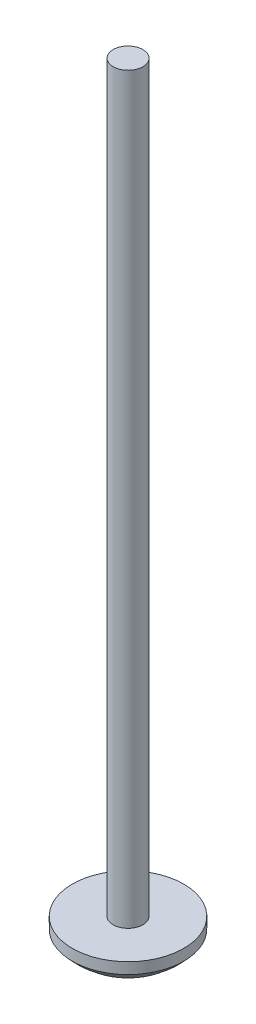
ISO-10303-21;
HEADER;
FILE_DESCRIPTION(('STEP AP214'),'2;1');
FILE_NAME('part.step','',(''),(''),'','','');
FILE_SCHEMA(('AUTOMOTIVE_DESIGN { 1 0 10303 214 1 1 1 1 }'));
ENDSEC;
DATA;
#1=APPLICATION_CONTEXT('core data for automotive mechanical design processes');
#2=APPLICATION_PROTOCOL_DEFINITION('international standard','automotive_design',2000,#1);
#3=PRODUCT_CONTEXT('',#1,'mechanical');
#4=PRODUCT('Part','Part','',(#3));
#5=PRODUCT_RELATED_PRODUCT_CATEGORY('part','',(#4));
#6=PRODUCT_DEFINITION_FORMATION('','',#4);
#7=PRODUCT_DEFINITION_CONTEXT('part definition',#1,'design');
#8=PRODUCT_DEFINITION('design','',#6,#7);
#9=PRODUCT_DEFINITION_SHAPE('','',#8);
#10=(LENGTH_UNIT() NAMED_UNIT(*) SI_UNIT(.MILLI.,.METRE.));
#11=(NAMED_UNIT(*) PLANE_ANGLE_UNIT() SI_UNIT($,.RADIAN.));
#12=(NAMED_UNIT(*) SI_UNIT($,.STERADIAN.) SOLID_ANGLE_UNIT());
#13=UNCERTAINTY_MEASURE_WITH_UNIT(LENGTH_MEASURE(1.E-05),#10,'distance_accuracy_value','');
#14=(GEOMETRIC_REPRESENTATION_CONTEXT(3) GLOBAL_UNCERTAINTY_ASSIGNED_CONTEXT((#13)) GLOBAL_UNIT_ASSIGNED_CONTEXT((#10,
#11,#12)) REPRESENTATION_CONTEXT('',''));
#15=CARTESIAN_POINT('',(0.,0.,0.));
#16=DIRECTION('',(0.,0.,1.));
#17=DIRECTION('',(1.,0.,0.));
#18=AXIS2_PLACEMENT_3D('',#15,#16,#17);
#19=CARTESIAN_POINT('',(0.,1.95714285714286,0.));
#20=DIRECTION('',(0.,-1.,0.));
#21=DIRECTION('',(-1.,0.,0.));
#22=AXIS2_PLACEMENT_3D('',#19,#20,#21);
#23=SPHERICAL_SURFACE('',#22,1.95714285714286);
#24=CARTESIAN_POINT('',(0.,0.7,0.));
#25=DIRECTION('',(0.,-1.,0.));
#26=DIRECTION('',(0.,0.,-1.));
#27=AXIS2_PLACEMENT_3D('',#24,#25,#26);
#28=CIRCLE('',#27,1.5);
#29=CARTESIAN_POINT('',(0.,0.7,-1.5));
#30=VERTEX_POINT('',#29);
#31=EDGE_CURVE('E10',#30,#30,#28,.T.);
#32=ORIENTED_EDGE('',*,*,#31,.T.);
#33=EDGE_LOOP('',(#32));
#34=FACE_BOUND('',#33,.T.);
#35=ADVANCED_FACE('F31',(#34),#23,.T.);
#36=CARTESIAN_POINT('',(0.,0.,0.));
#37=DIRECTION('',(0.,-1.,0.));
#38=DIRECTION('',(0.,0.,-1.));
#39=AXIS2_PLACEMENT_3D('',#36,#37,#38);
#40=CYLINDRICAL_SURFACE('',#39,1.5);
#41=ORIENTED_EDGE('',*,*,#31,.F.);
#42=EDGE_LOOP('',(#41));
#43=FACE_BOUND('',#42,.T.);
#44=CARTESIAN_POINT('',(0.,1.,0.));
#45=DIRECTION('',(0.,-1.,0.));
#46=DIRECTION('',(0.,0.,-1.));
#47=AXIS2_PLACEMENT_3D('',#44,#45,#46);
#48=CIRCLE('',#47,1.5);
#49=CARTESIAN_POINT('',(0.,1.,-1.5));
#50=VERTEX_POINT('',#49);
#51=EDGE_CURVE('E37',#50,#50,#48,.T.);
#52=ORIENTED_EDGE('',*,*,#51,.T.);
#53=EDGE_LOOP('',(#52));
#54=FACE_BOUND('',#53,.T.);
#55=ADVANCED_FACE('F63',(#43,#54),#40,.T.);
#56=CARTESIAN_POINT('',(-1.5,1.,0.));
#57=DIRECTION('',(0.,-1.,0.));
#58=DIRECTION('',(0.,0.,-1.));
#59=AXIS2_PLACEMENT_3D('',#56,#57,#58);
#60=PLANE('',#59);
#61=ORIENTED_EDGE('',*,*,#51,.F.);
#62=EDGE_LOOP('',(#61));
#63=FACE_BOUND('',#62,.T.);
#64=CARTESIAN_POINT('',(0.,1.,0.));
#65=DIRECTION('',(0.,-1.,0.));
#66=DIRECTION('',(0.,0.,-1.));
#67=AXIS2_PLACEMENT_3D('',#64,#65,#66);
#68=CIRCLE('',#67,0.4);
#69=CARTESIAN_POINT('',(0.,1.,-0.4));
#70=VERTEX_POINT('',#69);
#71=EDGE_CURVE('E41',#70,#70,#68,.T.);
#72=ORIENTED_EDGE('',*,*,#71,.T.);
#73=EDGE_LOOP('',(#72));
#74=FACE_BOUND('',#73,.T.);
#75=ADVANCED_FACE('F59',(#63,#74),#60,.F.);
#76=CARTESIAN_POINT('',(0.,0.,0.));
#77=DIRECTION('',(0.,-1.,0.));
#78=DIRECTION('',(0.,0.,-1.));
#79=AXIS2_PLACEMENT_3D('',#76,#77,#78);
#80=CYLINDRICAL_SURFACE('',#79,0.4);
#81=ORIENTED_EDGE('',*,*,#71,.F.);
#82=EDGE_LOOP('',(#81));
#83=FACE_BOUND('',#82,.T.);
#84=CARTESIAN_POINT('',(0.,21.,0.));
#85=DIRECTION('',(0.,-1.,0.));
#86=DIRECTION('',(0.,0.,-1.));
#87=AXIS2_PLACEMENT_3D('',#84,#85,#86);
#88=CIRCLE('',#87,0.4);
#89=CARTESIAN_POINT('',(0.,21.,-0.4));
#90=VERTEX_POINT('',#89);
#91=EDGE_CURVE('E45',#90,#90,#88,.T.);
#92=ORIENTED_EDGE('',*,*,#91,.T.);
#93=EDGE_LOOP('',(#92));
#94=FACE_BOUND('',#93,.T.);
#95=ADVANCED_FACE('F51',(#83,#94),#80,.T.);
#96=CARTESIAN_POINT('',(-0.4,21.,0.));
#97=DIRECTION('',(0.,-1.,0.));
#98=DIRECTION('',(0.,0.,-1.));
#99=AXIS2_PLACEMENT_3D('',#96,#97,#98);
#100=PLANE('',#99);
#101=ORIENTED_EDGE('',*,*,#91,.F.);
#102=EDGE_LOOP('',(#101));
#103=FACE_BOUND('',#102,.T.);
#104=ADVANCED_FACE('F53',(#103),#100,.F.);
#105=CLOSED_SHELL('',(#35,#55,#75,#95,#104));
#106=MANIFOLD_SOLID_BREP('B2',#105);
#107=ADVANCED_BREP_SHAPE_REPRESENTATION('',(#18,#106),#14);
#108=SHAPE_DEFINITION_REPRESENTATION(#9,#107);
ENDSEC;
END-ISO-10303-21;
